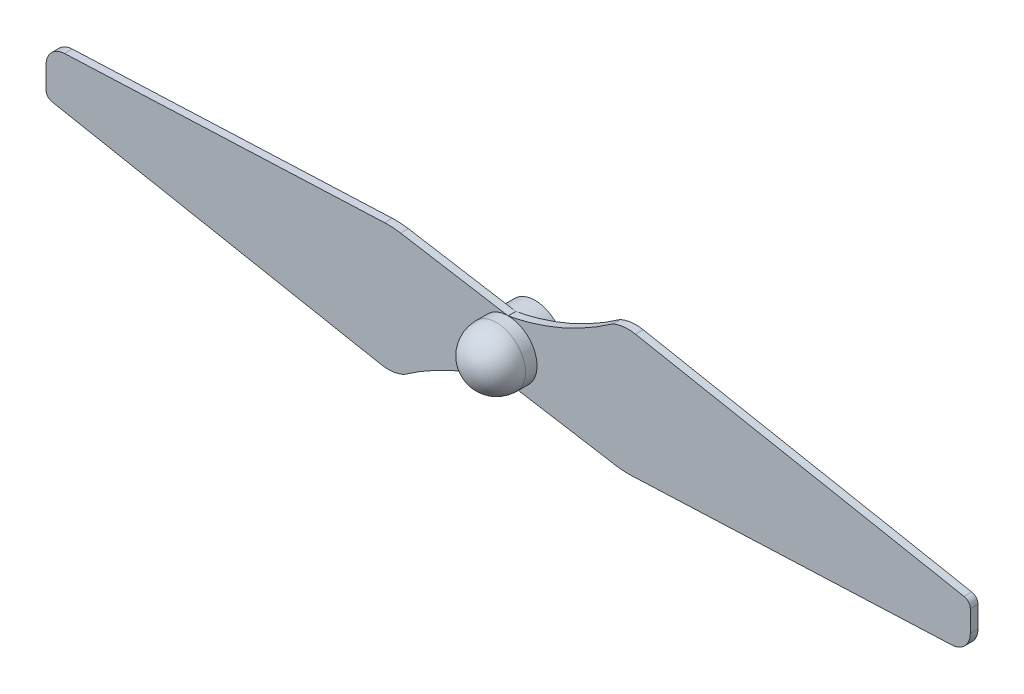
ISO-10303-21;
HEADER;
FILE_DESCRIPTION(('STEP AP214'),'2;1');
FILE_NAME('part.step','',(''),(''),'','','');
FILE_SCHEMA(('AUTOMOTIVE_DESIGN { 1 0 10303 214 1 1 1 1 }'));
ENDSEC;
DATA;
#1=APPLICATION_CONTEXT('core data for automotive mechanical design processes');
#2=APPLICATION_PROTOCOL_DEFINITION('international standard','automotive_design',2000,#1);
#3=PRODUCT_CONTEXT('',#1,'mechanical');
#4=PRODUCT('Part','Part','',(#3));
#5=PRODUCT_RELATED_PRODUCT_CATEGORY('part','',(#4));
#6=PRODUCT_DEFINITION_FORMATION('','',#4);
#7=PRODUCT_DEFINITION_CONTEXT('part definition',#1,'design');
#8=PRODUCT_DEFINITION('design','',#6,#7);
#9=PRODUCT_DEFINITION_SHAPE('','',#8);
#10=(LENGTH_UNIT() NAMED_UNIT(*) SI_UNIT(.MILLI.,.METRE.));
#11=(NAMED_UNIT(*) PLANE_ANGLE_UNIT() SI_UNIT($,.RADIAN.));
#12=(NAMED_UNIT(*) SI_UNIT($,.STERADIAN.) SOLID_ANGLE_UNIT());
#13=UNCERTAINTY_MEASURE_WITH_UNIT(LENGTH_MEASURE(1.E-05),#10,'distance_accuracy_value','');
#14=(GEOMETRIC_REPRESENTATION_CONTEXT(3) GLOBAL_UNCERTAINTY_ASSIGNED_CONTEXT((#13)) GLOBAL_UNIT_ASSIGNED_CONTEXT((#10,
#11,#12)) REPRESENTATION_CONTEXT('',''));
#15=CARTESIAN_POINT('',(0.,0.,0.));
#16=DIRECTION('',(0.,0.,1.));
#17=DIRECTION('',(1.,0.,0.));
#18=AXIS2_PLACEMENT_3D('',#15,#16,#17);
#19=CARTESIAN_POINT('',(0.,0.,10.));
#20=DIRECTION('',(0.,0.,-1.));
#21=DIRECTION('',(-1.,0.,0.));
#22=AXIS2_PLACEMENT_3D('',#19,#20,#21);
#23=CYLINDRICAL_SURFACE('',#22,7.5);
#24=CARTESIAN_POINT('',(0.,0.,10.));
#25=DIRECTION('',(0.,0.,1.));
#26=DIRECTION('',(1.,0.,0.));
#27=AXIS2_PLACEMENT_3D('',#24,#25,#26);
#28=CIRCLE('',#27,7.5);
#29=CARTESIAN_POINT('',(7.5,0.,10.));
#30=VERTEX_POINT('',#29);
#31=EDGE_CURVE('E11',#30,#30,#28,.T.);
#32=ORIENTED_EDGE('',*,*,#31,.F.);
#33=EDGE_LOOP('',(#32));
#34=FACE_BOUND('',#33,.T.);
#35=CARTESIAN_POINT('',(0.,0.,7.));
#36=DIRECTION('',(0.,0.,-1.));
#37=DIRECTION('',(-1.,0.,0.));
#38=AXIS2_PLACEMENT_3D('',#35,#36,#37);
#39=CIRCLE('',#38,7.5);
#40=CARTESIAN_POINT('',(0.,7.5,7.));
#41=VERTEX_POINT('',#40);
#42=CARTESIAN_POINT('',(0.,-7.5,7.));
#43=VERTEX_POINT('',#42);
#44=EDGE_CURVE('E291',#41,#43,#39,.T.);
#45=ORIENTED_EDGE('',*,*,#44,.F.);
#46=EDGE_CURVE('E51',#43,#41,#39,.T.);
#47=ORIENTED_EDGE('',*,*,#46,.F.);
#48=EDGE_LOOP('',(#45,#47));
#49=FACE_BOUND('',#48,.T.);
#50=ADVANCED_FACE('F37',(#34,#49),#23,.T.);
#51=CARTESIAN_POINT('',(0.,0.,10.));
#52=DIRECTION('',(0.,1.,0.));
#53=DIRECTION('',(0.,0.,1.));
#54=AXIS2_PLACEMENT_3D('',#51,#52,#53);
#55=SPHERICAL_SURFACE('',#54,7.5);
#56=CARTESIAN_POINT('',(0.,0.,10.));
#57=DIRECTION('',(0.,0.,1.));
#58=DIRECTION('',(1.,0.,0.));
#59=AXIS2_PLACEMENT_3D('',#56,#57,#58);
#60=SPHERICAL_SURFACE('',#59,7.5);
#61=ORIENTED_EDGE('',*,*,#31,.T.);
#62=EDGE_LOOP('',(#61));
#63=FACE_BOUND('',#62,.T.);
#64=ADVANCED_FACE('F275',(#63),#60,.T.);
#65=CARTESIAN_POINT('',(0.,0.,7.));
#66=DIRECTION('',(0.,0.,-1.));
#67=DIRECTION('',(-1.,0.,0.));
#68=AXIS2_PLACEMENT_3D('',#65,#66,#67);
#69=PLANE('',#68);
#70=CARTESIAN_POINT('',(27.1725837559361,19.2747862942392,7.));
#71=CARTESIAN_POINT('',(14.0344167476328,10.0811053046852,7.));
#72=CARTESIAN_POINT('',(0.,7.5,7.));
#73=B_SPLINE_CURVE_WITH_KNOTS('',2,(#70,#71,#72),.UNSPECIFIED.,.F.,.F.,(3,3),(0.,1.),.UNSPECIFIED.);
#74=CARTESIAN_POINT('',(27.1725837559361,19.2747862942392,7.));
#75=VERTEX_POINT('',#74);
#76=EDGE_CURVE('E177',#75,#41,#73,.T.);
#77=ORIENTED_EDGE('',*,*,#76,.T.);
#78=ORIENTED_EDGE('',*,*,#44,.T.);
#79=DIRECTION('',(-0.986393923832163,0.164398987305245,0.));
#80=VECTOR('',#79,1.);
#81=CARTESIAN_POINT('',(-1.21621621621541,-7.29729729729757,7.));
#82=LINE('',#81,#80);
#83=CARTESIAN_POINT('',(27.9482789369409,-12.1580464894869,7.));
#84=VERTEX_POINT('',#83);
#85=EDGE_CURVE('E210',#84,#43,#82,.T.);
#86=ORIENTED_EDGE('',*,*,#85,.F.);
#87=CARTESIAN_POINT('',(31.2362586830458,7.56983198715637,7.));
#88=DIRECTION('',(0.,0.,-1.));
#89=DIRECTION('',(-1.,0.,0.));
#90=AXIS2_PLACEMENT_3D('',#87,#88,#89);
#91=CIRCLE('',#90,20.);
#92=CARTESIAN_POINT('',(32.0781782100725,-12.4124394430392,7.));
#93=VERTEX_POINT('',#92);
#94=EDGE_CURVE('E207',#93,#84,#91,.T.);
#95=ORIENTED_EDGE('',*,*,#94,.F.);
#96=DIRECTION('',(-0.99911357150978,-0.0420959763513365,0.));
#97=VECTOR('',#96,1.);
#98=CARTESIAN_POINT('',(0.578895402731214,-13.7396089480417,7.));
#99=LINE('',#98,#97);
#100=CARTESIAN_POINT('',(115.210479881756,-8.90979919773144,7.));
#101=VERTEX_POINT('',#100);
#102=EDGE_CURVE('E204',#101,#93,#99,.T.);
#103=ORIENTED_EDGE('',*,*,#102,.F.);
#104=CARTESIAN_POINT('',(115.,-3.91423134018254,7.));
#105=DIRECTION('',(0.,0.,-1.));
#106=DIRECTION('',(-1.,0.,0.));
#107=AXIS2_PLACEMENT_3D('',#104,#105,#106);
#108=CIRCLE('',#107,5.);
#109=CARTESIAN_POINT('',(120.,-3.91423134018197,7.));
#110=VERTEX_POINT('',#109);
#111=EDGE_CURVE('E201',#110,#101,#108,.T.);
#112=ORIENTED_EDGE('',*,*,#111,.F.);
#113=DIRECTION('',(1.12473940876493E-13,-1.,0.));
#114=VECTOR('',#113,1.);
#115=CARTESIAN_POINT('',(119.999999999999,1.34968729051791E-11,7.));
#116=LINE('',#115,#114);
#117=CARTESIAN_POINT('',(119.999999999999,1.6381699225906,7.));
#118=VERTEX_POINT('',#117);
#119=EDGE_CURVE('E198',#118,#110,#116,.T.);
#120=ORIENTED_EDGE('',*,*,#119,.F.);
#121=CARTESIAN_POINT('',(117.999999999999,1.63816992259038,7.));
#122=DIRECTION('',(0.,0.,-1.));
#123=DIRECTION('',(-1.,0.,0.));
#124=AXIS2_PLACEMENT_3D('',#121,#122,#123);
#125=CIRCLE('',#124,2.);
#126=CARTESIAN_POINT('',(118.375596222964,3.6025852242246,7.));
#127=VERTEX_POINT('',#126);
#128=EDGE_CURVE('E190',#127,#118,#125,.T.);
#129=ORIENTED_EDGE('',*,*,#128,.F.);
#130=DIRECTION('',(0.982207650817114,-0.187798111482319,0.));
#131=VECTOR('',#130,1.);
#132=CARTESIAN_POINT('',(4.83940712938196,25.3107055783432,7.));
#133=LINE('',#132,#131);
#134=CARTESIAN_POINT('',(33.0266392471037,19.9213065493109,7.));
#135=VERTEX_POINT('',#134);
#136=EDGE_CURVE('E188',#135,#127,#133,.T.);
#137=ORIENTED_EDGE('',*,*,#136,.F.);
#138=CARTESIAN_POINT('',(31.1486581322792,10.09923004114,7.));
#139=DIRECTION('',(0.,0.,-1.));
#140=DIRECTION('',(-1.,0.,0.));
#141=AXIS2_PLACEMENT_3D('',#138,#139,#140);
#142=CIRCLE('',#141,9.99999999999999);
#143=EDGE_CURVE('E167',#75,#135,#142,.T.);
#144=ORIENTED_EDGE('',*,*,#143,.F.);
#145=EDGE_LOOP('',(#77,#78,#86,#95,#103,#112,#120,#129,#137,#144));
#146=FACE_BOUND('',#145,.T.);
#147=ADVANCED_FACE('F185',(#146),#69,.F.);
#148=CARTESIAN_POINT('',(-27.1725837559391,-19.2747862942361,7.));
#149=CARTESIAN_POINT('',(-14.0344167476329,-10.0811053046851,7.));
#150=CARTESIAN_POINT('',(0.,-7.5,7.));
#151=B_SPLINE_CURVE_WITH_KNOTS('',2,(#148,#149,#150),.UNSPECIFIED.,.F.,.F.,(3,3),(0.,1.),.UNSPECIFIED.);
#152=CARTESIAN_POINT('',(-27.1725837559391,-19.2747862942361,7.));
#153=VERTEX_POINT('',#152);
#154=EDGE_CURVE('E213',#153,#43,#151,.T.);
#155=ORIENTED_EDGE('',*,*,#154,.T.);
#156=ORIENTED_EDGE('',*,*,#46,.T.);
#157=DIRECTION('',(0.986393923832144,-0.164398987305357,0.));
#158=VECTOR('',#157,1.);
#159=CARTESIAN_POINT('',(1.21621621621622,7.2972972972973,7.));
#160=LINE('',#159,#158);
#161=CARTESIAN_POINT('',(-27.9482789369404,12.1580464894901,7.));
#162=VERTEX_POINT('',#161);
#163=EDGE_CURVE('E173',#162,#41,#160,.T.);
#164=ORIENTED_EDGE('',*,*,#163,.F.);
#165=CARTESIAN_POINT('',(-31.2362586830475,-7.56983198715282,7.));
#166=DIRECTION('',(0.,0.,-1.));
#167=DIRECTION('',(-1.,0.,0.));
#168=AXIS2_PLACEMENT_3D('',#165,#166,#167);
#169=CIRCLE('',#168,20.);
#170=CARTESIAN_POINT('',(-32.0781782100719,12.4124394430429,7.));
#171=VERTEX_POINT('',#170);
#172=EDGE_CURVE('E410',#171,#162,#169,.T.);
#173=ORIENTED_EDGE('',*,*,#172,.F.);
#174=DIRECTION('',(0.999113571509785,0.0420959763512226,0.));
#175=VECTOR('',#174,1.);
#176=CARTESIAN_POINT('',(-0.578895402729649,13.7396089480418,7.));
#177=LINE('',#176,#175);
#178=CARTESIAN_POINT('',(-115.210479881756,8.90979919774456,7.));
#179=VERTEX_POINT('',#178);
#180=EDGE_CURVE('E413',#179,#171,#177,.T.);
#181=ORIENTED_EDGE('',*,*,#180,.F.);
#182=CARTESIAN_POINT('',(-115.,3.91423134019502,7.));
#183=DIRECTION('',(0.,0.,-1.));
#184=DIRECTION('',(-1.,0.,0.));
#185=AXIS2_PLACEMENT_3D('',#182,#183,#184);
#186=CIRCLE('',#185,5.00000000000031);
#187=CARTESIAN_POINT('',(-120.,3.91423134019563,7.));
#188=VERTEX_POINT('',#187);
#189=EDGE_CURVE('E416',#188,#179,#186,.T.);
#190=ORIENTED_EDGE('',*,*,#189,.F.);
#191=DIRECTION('',(0.,1.,0.));
#192=VECTOR('',#191,1.);
#193=CARTESIAN_POINT('',(-120.,0.,7.));
#194=LINE('',#193,#192);
#195=CARTESIAN_POINT('',(-120.,-1.63816992257695,7.));
#196=VERTEX_POINT('',#195);
#197=EDGE_CURVE('E419',#196,#188,#194,.T.);
#198=ORIENTED_EDGE('',*,*,#197,.F.);
#199=CARTESIAN_POINT('',(-118.,-1.63816992257761,7.));
#200=DIRECTION('',(0.,0.,-1.));
#201=DIRECTION('',(-1.,0.,0.));
#202=AXIS2_PLACEMENT_3D('',#199,#200,#201);
#203=CIRCLE('',#202,1.99999999999967);
#204=CARTESIAN_POINT('',(-118.375596222965,-3.60258522421113,7.));
#205=VERTEX_POINT('',#204);
#206=EDGE_CURVE('E422',#205,#196,#203,.T.);
#207=ORIENTED_EDGE('',*,*,#206,.F.);
#208=DIRECTION('',(-0.982207650817092,0.187798111482438,0.));
#209=VECTOR('',#208,1.);
#210=CARTESIAN_POINT('',(-4.83940712938521,-25.3107055783436,7.));
#211=LINE('',#210,#209);
#212=CARTESIAN_POINT('',(-33.0266392471066,-19.9213065493078,7.));
#213=VERTEX_POINT('',#212);
#214=EDGE_CURVE('E424',#213,#205,#211,.T.);
#215=ORIENTED_EDGE('',*,*,#214,.F.);
#216=CARTESIAN_POINT('',(-31.1486581322822,-10.0992300411369,7.));
#217=DIRECTION('',(0.,0.,-1.));
#218=DIRECTION('',(-1.,0.,0.));
#219=AXIS2_PLACEMENT_3D('',#216,#217,#218);
#220=CIRCLE('',#219,10.);
#221=EDGE_CURVE('E219',#153,#213,#220,.T.);
#222=ORIENTED_EDGE('',*,*,#221,.F.);
#223=EDGE_LOOP('',(#155,#156,#164,#173,#181,#190,#198,#207,#215,#222));
#224=FACE_BOUND('',#223,.T.);
#225=ADVANCED_FACE('F297',(#224),#69,.F.);
#226=CARTESIAN_POINT('',(0.,0.,5.));
#227=DIRECTION('',(0.,0.,-1.));
#228=DIRECTION('',(-1.,0.,0.));
#229=AXIS2_PLACEMENT_3D('',#226,#227,#228);
#230=PLANE('',#229);
#231=CARTESIAN_POINT('',(0.,0.,5.));
#232=DIRECTION('',(0.,0.,-1.));
#233=DIRECTION('',(-1.,0.,0.));
#234=AXIS2_PLACEMENT_3D('',#231,#232,#233);
#235=CIRCLE('',#234,7.5);
#236=CARTESIAN_POINT('',(0.,7.5,5.));
#237=VERTEX_POINT('',#236);
#238=CARTESIAN_POINT('',(0.,-7.5,5.));
#239=VERTEX_POINT('',#238);
#240=EDGE_CURVE('E302',#237,#239,#235,.T.);
#241=ORIENTED_EDGE('',*,*,#240,.F.);
#242=CARTESIAN_POINT('',(27.1725837559361,19.2747862942392,5.));
#243=CARTESIAN_POINT('',(14.0344167476328,10.0811053046852,5.));
#244=CARTESIAN_POINT('',(0.,7.5,5.));
#245=B_SPLINE_CURVE_WITH_KNOTS('',2,(#242,#243,#244),.UNSPECIFIED.,.F.,.F.,(3,3),(0.,1.),.UNSPECIFIED.);
#246=CARTESIAN_POINT('',(27.1725837559361,19.2747862942392,5.));
#247=VERTEX_POINT('',#246);
#248=EDGE_CURVE('E402',#247,#237,#245,.T.);
#249=ORIENTED_EDGE('',*,*,#248,.F.);
#250=CARTESIAN_POINT('',(31.1486581322792,10.09923004114,5.));
#251=DIRECTION('',(0.,0.,-1.));
#252=DIRECTION('',(-1.,0.,0.));
#253=AXIS2_PLACEMENT_3D('',#250,#251,#252);
#254=CIRCLE('',#253,9.99999999999999);
#255=CARTESIAN_POINT('',(33.0266392471037,19.9213065493109,5.));
#256=VERTEX_POINT('',#255);
#257=EDGE_CURVE('E169',#247,#256,#254,.T.);
#258=ORIENTED_EDGE('',*,*,#257,.T.);
#259=DIRECTION('',(0.982207650817114,-0.187798111482319,0.));
#260=VECTOR('',#259,1.);
#261=CARTESIAN_POINT('',(4.83940712938196,25.3107055783432,5.));
#262=LINE('',#261,#260);
#263=CARTESIAN_POINT('',(118.375596222964,3.6025852242246,5.));
#264=VERTEX_POINT('',#263);
#265=EDGE_CURVE('E398',#256,#264,#262,.T.);
#266=ORIENTED_EDGE('',*,*,#265,.T.);
#267=CARTESIAN_POINT('',(117.999999999999,1.63816992259038,5.));
#268=DIRECTION('',(0.,0.,-1.));
#269=DIRECTION('',(-1.,0.,0.));
#270=AXIS2_PLACEMENT_3D('',#267,#268,#269);
#271=CIRCLE('',#270,2.);
#272=CARTESIAN_POINT('',(119.999999999999,1.6381699225906,5.));
#273=VERTEX_POINT('',#272);
#274=EDGE_CURVE('E395',#264,#273,#271,.T.);
#275=ORIENTED_EDGE('',*,*,#274,.T.);
#276=DIRECTION('',(1.12473940876493E-13,-1.,0.));
#277=VECTOR('',#276,1.);
#278=CARTESIAN_POINT('',(119.999999999999,1.34968729051791E-11,5.));
#279=LINE('',#278,#277);
#280=CARTESIAN_POINT('',(120.,-3.91423134018197,5.));
#281=VERTEX_POINT('',#280);
#282=EDGE_CURVE('E392',#273,#281,#279,.T.);
#283=ORIENTED_EDGE('',*,*,#282,.T.);
#284=CARTESIAN_POINT('',(115.,-3.91423134018254,5.));
#285=DIRECTION('',(0.,0.,-1.));
#286=DIRECTION('',(-1.,0.,0.));
#287=AXIS2_PLACEMENT_3D('',#284,#285,#286);
#288=CIRCLE('',#287,5.);
#289=CARTESIAN_POINT('',(115.210479881756,-8.90979919773144,5.));
#290=VERTEX_POINT('',#289);
#291=EDGE_CURVE('E389',#281,#290,#288,.T.);
#292=ORIENTED_EDGE('',*,*,#291,.T.);
#293=DIRECTION('',(-0.99911357150978,-0.0420959763513365,0.));
#294=VECTOR('',#293,1.);
#295=CARTESIAN_POINT('',(0.578895402731214,-13.7396089480417,5.));
#296=LINE('',#295,#294);
#297=CARTESIAN_POINT('',(32.0781782100725,-12.4124394430392,5.));
#298=VERTEX_POINT('',#297);
#299=EDGE_CURVE('E386',#290,#298,#296,.T.);
#300=ORIENTED_EDGE('',*,*,#299,.T.);
#301=CARTESIAN_POINT('',(31.2362586830458,7.56983198715637,5.));
#302=DIRECTION('',(0.,0.,-1.));
#303=DIRECTION('',(-1.,0.,0.));
#304=AXIS2_PLACEMENT_3D('',#301,#302,#303);
#305=CIRCLE('',#304,20.);
#306=CARTESIAN_POINT('',(27.9482789369409,-12.1580464894869,5.));
#307=VERTEX_POINT('',#306);
#308=EDGE_CURVE('E383',#298,#307,#305,.T.);
#309=ORIENTED_EDGE('',*,*,#308,.T.);
#310=DIRECTION('',(-0.986393923832163,0.164398987305245,0.));
#311=VECTOR('',#310,1.);
#312=CARTESIAN_POINT('',(-1.21621621621541,-7.29729729729757,5.));
#313=LINE('',#312,#311);
#314=EDGE_CURVE('E377',#307,#239,#313,.T.);
#315=ORIENTED_EDGE('',*,*,#314,.T.);
#316=EDGE_LOOP('',(#241,#249,#258,#266,#275,#283,#292,#300,#309,#315));
#317=FACE_BOUND('',#316,.T.);
#318=ADVANCED_FACE('F444',(#317),#230,.T.);
#319=EDGE_CURVE('E304',#239,#237,#235,.T.);
#320=ORIENTED_EDGE('',*,*,#319,.F.);
#321=CARTESIAN_POINT('',(-27.1725837559391,-19.2747862942361,5.));
#322=CARTESIAN_POINT('',(-14.0344167476329,-10.0811053046851,5.));
#323=CARTESIAN_POINT('',(0.,-7.5,5.));
#324=B_SPLINE_CURVE_WITH_KNOTS('',2,(#321,#322,#323),.UNSPECIFIED.,.F.,.F.,(3,3),(0.,1.),.UNSPECIFIED.);
#325=CARTESIAN_POINT('',(-27.1725837559391,-19.2747862942361,5.));
#326=VERTEX_POINT('',#325);
#327=EDGE_CURVE('E372',#326,#239,#324,.T.);
#328=ORIENTED_EDGE('',*,*,#327,.F.);
#329=CARTESIAN_POINT('',(-31.1486581322822,-10.0992300411369,5.));
#330=DIRECTION('',(0.,0.,-1.));
#331=DIRECTION('',(-1.,0.,0.));
#332=AXIS2_PLACEMENT_3D('',#329,#330,#331);
#333=CIRCLE('',#332,10.);
#334=CARTESIAN_POINT('',(-33.0266392471066,-19.9213065493078,5.));
#335=VERTEX_POINT('',#334);
#336=EDGE_CURVE('E369',#326,#335,#333,.T.);
#337=ORIENTED_EDGE('',*,*,#336,.T.);
#338=DIRECTION('',(-0.982207650817092,0.187798111482438,0.));
#339=VECTOR('',#338,1.);
#340=CARTESIAN_POINT('',(-4.83940712938521,-25.3107055783436,5.));
#341=LINE('',#340,#339);
#342=CARTESIAN_POINT('',(-118.375596222965,-3.60258522421113,5.));
#343=VERTEX_POINT('',#342);
#344=EDGE_CURVE('E366',#335,#343,#341,.T.);
#345=ORIENTED_EDGE('',*,*,#344,.T.);
#346=CARTESIAN_POINT('',(-118.,-1.63816992257761,5.));
#347=DIRECTION('',(0.,0.,-1.));
#348=DIRECTION('',(-1.,0.,0.));
#349=AXIS2_PLACEMENT_3D('',#346,#347,#348);
#350=CIRCLE('',#349,1.99999999999967);
#351=CARTESIAN_POINT('',(-120.,-1.63816992257695,5.));
#352=VERTEX_POINT('',#351);
#353=EDGE_CURVE('E363',#343,#352,#350,.T.);
#354=ORIENTED_EDGE('',*,*,#353,.T.);
#355=DIRECTION('',(0.,1.,0.));
#356=VECTOR('',#355,1.);
#357=CARTESIAN_POINT('',(-120.,0.,5.));
#358=LINE('',#357,#356);
#359=CARTESIAN_POINT('',(-120.,3.91423134019563,5.));
#360=VERTEX_POINT('',#359);
#361=EDGE_CURVE('E360',#352,#360,#358,.T.);
#362=ORIENTED_EDGE('',*,*,#361,.T.);
#363=CARTESIAN_POINT('',(-115.,3.91423134019502,5.));
#364=DIRECTION('',(0.,0.,-1.));
#365=DIRECTION('',(-1.,0.,0.));
#366=AXIS2_PLACEMENT_3D('',#363,#364,#365);
#367=CIRCLE('',#366,5.00000000000031);
#368=CARTESIAN_POINT('',(-115.210479881756,8.90979919774456,5.));
#369=VERTEX_POINT('',#368);
#370=EDGE_CURVE('E357',#360,#369,#367,.T.);
#371=ORIENTED_EDGE('',*,*,#370,.T.);
#372=DIRECTION('',(0.999113571509785,0.0420959763512226,0.));
#373=VECTOR('',#372,1.);
#374=CARTESIAN_POINT('',(-0.578895402729649,13.7396089480418,5.));
#375=LINE('',#374,#373);
#376=CARTESIAN_POINT('',(-32.0781782100719,12.4124394430429,5.));
#377=VERTEX_POINT('',#376);
#378=EDGE_CURVE('E354',#369,#377,#375,.T.);
#379=ORIENTED_EDGE('',*,*,#378,.T.);
#380=CARTESIAN_POINT('',(-31.2362586830475,-7.56983198715282,5.));
#381=DIRECTION('',(0.,0.,-1.));
#382=DIRECTION('',(-1.,0.,0.));
#383=AXIS2_PLACEMENT_3D('',#380,#381,#382);
#384=CIRCLE('',#383,20.);
#385=CARTESIAN_POINT('',(-27.9482789369404,12.1580464894901,5.));
#386=VERTEX_POINT('',#385);
#387=EDGE_CURVE('E352',#377,#386,#384,.T.);
#388=ORIENTED_EDGE('',*,*,#387,.T.);
#389=DIRECTION('',(0.986393923832144,-0.164398987305357,0.));
#390=VECTOR('',#389,1.);
#391=CARTESIAN_POINT('',(1.21621621621622,7.2972972972973,5.));
#392=LINE('',#391,#390);
#393=EDGE_CURVE('E59',#386,#237,#392,.T.);
#394=ORIENTED_EDGE('',*,*,#393,.T.);
#395=EDGE_LOOP('',(#320,#328,#337,#345,#354,#362,#371,#379,#388,#394));
#396=FACE_BOUND('',#395,.T.);
#397=ADVANCED_FACE('F265',(#396),#230,.T.);
#398=DIRECTION('',(0.,0.,-1.));
#399=VECTOR('',#398,1.);
#400=SURFACE_OF_LINEAR_EXTRUSION('',#73,#399);
#401=ORIENTED_EDGE('',*,*,#248,.T.);
#402=DIRECTION('',(0.,0.,-1.));
#403=VECTOR('',#402,1.);
#404=CARTESIAN_POINT('',(0.,7.5,7.));
#405=LINE('',#404,#403);
#406=EDGE_CURVE('E180',#41,#237,#405,.T.);
#407=ORIENTED_EDGE('',*,*,#406,.F.);
#408=ORIENTED_EDGE('',*,*,#76,.F.);
#409=DIRECTION('',(0.,0.,-1.));
#410=VECTOR('',#409,1.);
#411=CARTESIAN_POINT('',(27.1725837559361,19.2747862942392,7.));
#412=LINE('',#411,#410);
#413=EDGE_CURVE('E163',#75,#247,#412,.T.);
#414=ORIENTED_EDGE('',*,*,#413,.T.);
#415=EDGE_LOOP('',(#401,#407,#408,#414));
#416=FACE_BOUND('',#415,.T.);
#417=ADVANCED_FACE('F178',(#416),#400,.F.);
#418=CARTESIAN_POINT('',(1.21621621621622,7.2972972972973,7.));
#419=DIRECTION('',(0.164398987305357,0.986393923832144,0.));
#420=DIRECTION('',(-0.986393923832144,0.164398987305357,0.));
#421=AXIS2_PLACEMENT_3D('',#418,#419,#420);
#422=PLANE('',#421);
#423=ORIENTED_EDGE('',*,*,#393,.F.);
#424=DIRECTION('',(0.,0.,-1.));
#425=VECTOR('',#424,1.);
#426=CARTESIAN_POINT('',(-27.9482789369404,12.1580464894901,7.));
#427=LINE('',#426,#425);
#428=EDGE_CURVE('E348',#162,#386,#427,.T.);
#429=ORIENTED_EDGE('',*,*,#428,.F.);
#430=ORIENTED_EDGE('',*,*,#163,.T.);
#431=ORIENTED_EDGE('',*,*,#406,.T.);
#432=EDGE_LOOP('',(#423,#429,#430,#431));
#433=FACE_BOUND('',#432,.T.);
#434=ADVANCED_FACE('F264',(#433),#422,.T.);
#435=CARTESIAN_POINT('',(-31.2362586830475,-7.56983198715282,7.));
#436=DIRECTION('',(0.,0.,-1.));
#437=DIRECTION('',(-1.,0.,0.));
#438=AXIS2_PLACEMENT_3D('',#435,#436,#437);
#439=CYLINDRICAL_SURFACE('',#438,20.);
#440=ORIENTED_EDGE('',*,*,#387,.F.);
#441=DIRECTION('',(0.,0.,-1.));
#442=VECTOR('',#441,1.);
#443=CARTESIAN_POINT('',(-32.0781782100719,12.4124394430429,7.));
#444=LINE('',#443,#442);
#445=EDGE_CURVE('E346',#171,#377,#444,.T.);
#446=ORIENTED_EDGE('',*,*,#445,.F.);
#447=ORIENTED_EDGE('',*,*,#172,.T.);
#448=ORIENTED_EDGE('',*,*,#428,.T.);
#449=EDGE_LOOP('',(#440,#446,#447,#448));
#450=FACE_BOUND('',#449,.T.);
#451=ADVANCED_FACE('F458',(#450),#439,.T.);
#452=CARTESIAN_POINT('',(-0.578895402729649,13.7396089480418,7.));
#453=DIRECTION('',(-0.0420959763512226,0.999113571509785,0.));
#454=DIRECTION('',(-0.999113571509785,-0.0420959763512226,0.));
#455=AXIS2_PLACEMENT_3D('',#452,#453,#454);
#456=PLANE('',#455);
#457=ORIENTED_EDGE('',*,*,#378,.F.);
#458=DIRECTION('',(0.,0.,-1.));
#459=VECTOR('',#458,1.);
#460=CARTESIAN_POINT('',(-115.210479881756,8.90979919774456,7.));
#461=LINE('',#460,#459);
#462=EDGE_CURVE('E344',#179,#369,#461,.T.);
#463=ORIENTED_EDGE('',*,*,#462,.F.);
#464=ORIENTED_EDGE('',*,*,#180,.T.);
#465=ORIENTED_EDGE('',*,*,#445,.T.);
#466=EDGE_LOOP('',(#457,#463,#464,#465));
#467=FACE_BOUND('',#466,.T.);
#468=ADVANCED_FACE('F462',(#467),#456,.T.);
#469=CARTESIAN_POINT('',(-115.,3.91423134019502,7.));
#470=DIRECTION('',(0.,0.,-1.));
#471=DIRECTION('',(-1.,0.,0.));
#472=AXIS2_PLACEMENT_3D('',#469,#470,#471);
#473=CYLINDRICAL_SURFACE('',#472,5.00000000000031);
#474=ORIENTED_EDGE('',*,*,#370,.F.);
#475=DIRECTION('',(0.,0.,-1.));
#476=VECTOR('',#475,1.);
#477=CARTESIAN_POINT('',(-120.,3.91423134019563,7.));
#478=LINE('',#477,#476);
#479=EDGE_CURVE('E342',#188,#360,#478,.T.);
#480=ORIENTED_EDGE('',*,*,#479,.F.);
#481=ORIENTED_EDGE('',*,*,#189,.T.);
#482=ORIENTED_EDGE('',*,*,#462,.T.);
#483=EDGE_LOOP('',(#474,#480,#481,#482));
#484=FACE_BOUND('',#483,.T.);
#485=ADVANCED_FACE('F465',(#484),#473,.T.);
#486=CARTESIAN_POINT('',(-120.,0.,7.));
#487=DIRECTION('',(-1.,0.,0.));
#488=DIRECTION('',(0.,0.,1.));
#489=AXIS2_PLACEMENT_3D('',#486,#487,#488);
#490=PLANE('',#489);
#491=ORIENTED_EDGE('',*,*,#361,.F.);
#492=DIRECTION('',(0.,0.,-1.));
#493=VECTOR('',#492,1.);
#494=CARTESIAN_POINT('',(-120.,-1.63816992257695,7.));
#495=LINE('',#494,#493);
#496=EDGE_CURVE('E340',#196,#352,#495,.T.);
#497=ORIENTED_EDGE('',*,*,#496,.F.);
#498=ORIENTED_EDGE('',*,*,#197,.T.);
#499=ORIENTED_EDGE('',*,*,#479,.T.);
#500=EDGE_LOOP('',(#491,#497,#498,#499));
#501=FACE_BOUND('',#500,.T.);
#502=ADVANCED_FACE('F467',(#501),#490,.T.);
#503=CARTESIAN_POINT('',(-118.,-1.63816992257761,7.));
#504=DIRECTION('',(0.,0.,-1.));
#505=DIRECTION('',(-1.,0.,0.));
#506=AXIS2_PLACEMENT_3D('',#503,#504,#505);
#507=CYLINDRICAL_SURFACE('',#506,1.99999999999967);
#508=ORIENTED_EDGE('',*,*,#353,.F.);
#509=DIRECTION('',(0.,0.,-1.));
#510=VECTOR('',#509,1.);
#511=CARTESIAN_POINT('',(-118.375596222965,-3.60258522421113,7.));
#512=LINE('',#511,#510);
#513=EDGE_CURVE('E338',#205,#343,#512,.T.);
#514=ORIENTED_EDGE('',*,*,#513,.F.);
#515=ORIENTED_EDGE('',*,*,#206,.T.);
#516=ORIENTED_EDGE('',*,*,#496,.T.);
#517=EDGE_LOOP('',(#508,#514,#515,#516));
#518=FACE_BOUND('',#517,.T.);
#519=ADVANCED_FACE('F437',(#518),#507,.T.);
#520=CARTESIAN_POINT('',(-4.83940712938521,-25.3107055783436,7.));
#521=DIRECTION('',(-0.187798111482438,-0.982207650817092,0.));
#522=DIRECTION('',(0.982207650817092,-0.187798111482438,0.));
#523=AXIS2_PLACEMENT_3D('',#520,#521,#522);
#524=PLANE('',#523);
#525=ORIENTED_EDGE('',*,*,#344,.F.);
#526=DIRECTION('',(0.,0.,-1.));
#527=VECTOR('',#526,1.);
#528=CARTESIAN_POINT('',(-33.0266392471066,-19.9213065493078,7.));
#529=LINE('',#528,#527);
#530=EDGE_CURVE('E336',#213,#335,#529,.T.);
#531=ORIENTED_EDGE('',*,*,#530,.F.);
#532=ORIENTED_EDGE('',*,*,#214,.T.);
#533=ORIENTED_EDGE('',*,*,#513,.T.);
#534=EDGE_LOOP('',(#525,#531,#532,#533));
#535=FACE_BOUND('',#534,.T.);
#536=ADVANCED_FACE('F439',(#535),#524,.T.);
#537=CARTESIAN_POINT('',(-31.1486581322822,-10.0992300411369,7.));
#538=DIRECTION('',(0.,0.,-1.));
#539=DIRECTION('',(-1.,0.,0.));
#540=AXIS2_PLACEMENT_3D('',#537,#538,#539);
#541=CYLINDRICAL_SURFACE('',#540,10.);
#542=ORIENTED_EDGE('',*,*,#336,.F.);
#543=DIRECTION('',(0.,0.,-1.));
#544=VECTOR('',#543,1.);
#545=CARTESIAN_POINT('',(-27.1725837559391,-19.2747862942361,7.));
#546=LINE('',#545,#544);
#547=EDGE_CURVE('E334',#153,#326,#546,.T.);
#548=ORIENTED_EDGE('',*,*,#547,.F.);
#549=ORIENTED_EDGE('',*,*,#221,.T.);
#550=ORIENTED_EDGE('',*,*,#530,.T.);
#551=EDGE_LOOP('',(#542,#548,#549,#550));
#552=FACE_BOUND('',#551,.T.);
#553=ADVANCED_FACE('F230',(#552),#541,.T.);
#554=DIRECTION('',(0.,0.,-1.));
#555=VECTOR('',#554,1.);
#556=SURFACE_OF_LINEAR_EXTRUSION('',#151,#555);
#557=ORIENTED_EDGE('',*,*,#327,.T.);
#558=DIRECTION('',(0.,0.,-1.));
#559=VECTOR('',#558,1.);
#560=CARTESIAN_POINT('',(0.,-7.5,7.));
#561=LINE('',#560,#559);
#562=EDGE_CURVE('E331',#43,#239,#561,.T.);
#563=ORIENTED_EDGE('',*,*,#562,.F.);
#564=ORIENTED_EDGE('',*,*,#154,.F.);
#565=ORIENTED_EDGE('',*,*,#547,.T.);
#566=EDGE_LOOP('',(#557,#563,#564,#565));
#567=FACE_BOUND('',#566,.T.);
#568=ADVANCED_FACE('F225',(#567),#556,.F.);
#569=CARTESIAN_POINT('',(-1.21621621621541,-7.29729729729757,7.));
#570=DIRECTION('',(-0.164398987305245,-0.986393923832163,0.));
#571=DIRECTION('',(0.986393923832163,-0.164398987305245,0.));
#572=AXIS2_PLACEMENT_3D('',#569,#570,#571);
#573=PLANE('',#572);
#574=ORIENTED_EDGE('',*,*,#314,.F.);
#575=DIRECTION('',(0.,0.,-1.));
#576=VECTOR('',#575,1.);
#577=CARTESIAN_POINT('',(27.9482789369409,-12.1580464894869,7.));
#578=LINE('',#577,#576);
#579=EDGE_CURVE('E329',#84,#307,#578,.T.);
#580=ORIENTED_EDGE('',*,*,#579,.F.);
#581=ORIENTED_EDGE('',*,*,#85,.T.);
#582=ORIENTED_EDGE('',*,*,#562,.T.);
#583=EDGE_LOOP('',(#574,#580,#581,#582));
#584=FACE_BOUND('',#583,.T.);
#585=ADVANCED_FACE('F229',(#584),#573,.T.);
#586=CARTESIAN_POINT('',(31.2362586830458,7.56983198715637,7.));
#587=DIRECTION('',(0.,0.,-1.));
#588=DIRECTION('',(-1.,0.,0.));
#589=AXIS2_PLACEMENT_3D('',#586,#587,#588);
#590=CYLINDRICAL_SURFACE('',#589,20.);
#591=ORIENTED_EDGE('',*,*,#308,.F.);
#592=DIRECTION('',(0.,0.,-1.));
#593=VECTOR('',#592,1.);
#594=CARTESIAN_POINT('',(32.0781782100725,-12.4124394430392,7.));
#595=LINE('',#594,#593);
#596=EDGE_CURVE('E327',#93,#298,#595,.T.);
#597=ORIENTED_EDGE('',*,*,#596,.F.);
#598=ORIENTED_EDGE('',*,*,#94,.T.);
#599=ORIENTED_EDGE('',*,*,#579,.T.);
#600=EDGE_LOOP('',(#591,#597,#598,#599));
#601=FACE_BOUND('',#600,.T.);
#602=ADVANCED_FACE('F235',(#601),#590,.T.);
#603=CARTESIAN_POINT('',(0.578895402731214,-13.7396089480417,7.));
#604=DIRECTION('',(0.0420959763513365,-0.99911357150978,0.));
#605=DIRECTION('',(0.99911357150978,0.0420959763513365,0.));
#606=AXIS2_PLACEMENT_3D('',#603,#604,#605);
#607=PLANE('',#606);
#608=ORIENTED_EDGE('',*,*,#299,.F.);
#609=DIRECTION('',(0.,0.,-1.));
#610=VECTOR('',#609,1.);
#611=CARTESIAN_POINT('',(115.210479881756,-8.90979919773144,7.));
#612=LINE('',#611,#610);
#613=EDGE_CURVE('E325',#101,#290,#612,.T.);
#614=ORIENTED_EDGE('',*,*,#613,.F.);
#615=ORIENTED_EDGE('',*,*,#102,.T.);
#616=ORIENTED_EDGE('',*,*,#596,.T.);
#617=EDGE_LOOP('',(#608,#614,#615,#616));
#618=FACE_BOUND('',#617,.T.);
#619=ADVANCED_FACE('F239',(#618),#607,.T.);
#620=CARTESIAN_POINT('',(115.,-3.91423134018254,7.));
#621=DIRECTION('',(0.,0.,-1.));
#622=DIRECTION('',(-1.,0.,0.));
#623=AXIS2_PLACEMENT_3D('',#620,#621,#622);
#624=CYLINDRICAL_SURFACE('',#623,5.);
#625=ORIENTED_EDGE('',*,*,#291,.F.);
#626=DIRECTION('',(0.,0.,-1.));
#627=VECTOR('',#626,1.);
#628=CARTESIAN_POINT('',(120.,-3.91423134018197,7.));
#629=LINE('',#628,#627);
#630=EDGE_CURVE('E323',#110,#281,#629,.T.);
#631=ORIENTED_EDGE('',*,*,#630,.F.);
#632=ORIENTED_EDGE('',*,*,#111,.T.);
#633=ORIENTED_EDGE('',*,*,#613,.T.);
#634=EDGE_LOOP('',(#625,#631,#632,#633));
#635=FACE_BOUND('',#634,.T.);
#636=ADVANCED_FACE('F243',(#635),#624,.T.);
#637=CARTESIAN_POINT('',(119.999999999999,1.34968729051791E-11,7.));
#638=DIRECTION('',(1.,1.12473940876493E-13,0.));
#639=DIRECTION('',(-1.12473940876493E-13,1.,0.));
#640=AXIS2_PLACEMENT_3D('',#637,#638,#639);
#641=PLANE('',#640);
#642=ORIENTED_EDGE('',*,*,#282,.F.);
#643=DIRECTION('',(0.,0.,-1.));
#644=VECTOR('',#643,1.);
#645=CARTESIAN_POINT('',(119.999999999999,1.6381699225906,7.));
#646=LINE('',#645,#644);
#647=EDGE_CURVE('E321',#118,#273,#646,.T.);
#648=ORIENTED_EDGE('',*,*,#647,.F.);
#649=ORIENTED_EDGE('',*,*,#119,.T.);
#650=ORIENTED_EDGE('',*,*,#630,.T.);
#651=EDGE_LOOP('',(#642,#648,#649,#650));
#652=FACE_BOUND('',#651,.T.);
#653=ADVANCED_FACE('F247',(#652),#641,.T.);
#654=CARTESIAN_POINT('',(117.999999999999,1.63816992259038,7.));
#655=DIRECTION('',(0.,0.,-1.));
#656=DIRECTION('',(-1.,0.,0.));
#657=AXIS2_PLACEMENT_3D('',#654,#655,#656);
#658=CYLINDRICAL_SURFACE('',#657,2.);
#659=ORIENTED_EDGE('',*,*,#274,.F.);
#660=DIRECTION('',(0.,0.,-1.));
#661=VECTOR('',#660,1.);
#662=CARTESIAN_POINT('',(118.375596222964,3.6025852242246,7.));
#663=LINE('',#662,#661);
#664=EDGE_CURVE('E319',#127,#264,#663,.T.);
#665=ORIENTED_EDGE('',*,*,#664,.F.);
#666=ORIENTED_EDGE('',*,*,#128,.T.);
#667=ORIENTED_EDGE('',*,*,#647,.T.);
#668=EDGE_LOOP('',(#659,#665,#666,#667));
#669=FACE_BOUND('',#668,.T.);
#670=ADVANCED_FACE('F251',(#669),#658,.T.);
#671=CARTESIAN_POINT('',(4.83940712938196,25.3107055783432,7.));
#672=DIRECTION('',(0.187798111482319,0.982207650817114,0.));
#673=DIRECTION('',(-0.982207650817114,0.187798111482319,0.));
#674=AXIS2_PLACEMENT_3D('',#671,#672,#673);
#675=PLANE('',#674);
#676=ORIENTED_EDGE('',*,*,#265,.F.);
#677=DIRECTION('',(0.,0.,-1.));
#678=VECTOR('',#677,1.);
#679=CARTESIAN_POINT('',(33.0266392471037,19.9213065493109,7.));
#680=LINE('',#679,#678);
#681=EDGE_CURVE('E172',#135,#256,#680,.T.);
#682=ORIENTED_EDGE('',*,*,#681,.F.);
#683=ORIENTED_EDGE('',*,*,#136,.T.);
#684=ORIENTED_EDGE('',*,*,#664,.T.);
#685=EDGE_LOOP('',(#676,#682,#683,#684));
#686=FACE_BOUND('',#685,.T.);
#687=ADVANCED_FACE('F255',(#686),#675,.T.);
#688=CARTESIAN_POINT('',(31.1486581322792,10.09923004114,7.));
#689=DIRECTION('',(0.,0.,-1.));
#690=DIRECTION('',(-1.,0.,0.));
#691=AXIS2_PLACEMENT_3D('',#688,#689,#690);
#692=CYLINDRICAL_SURFACE('',#691,9.99999999999999);
#693=ORIENTED_EDGE('',*,*,#257,.F.);
#694=ORIENTED_EDGE('',*,*,#413,.F.);
#695=ORIENTED_EDGE('',*,*,#143,.T.);
#696=ORIENTED_EDGE('',*,*,#681,.T.);
#697=EDGE_LOOP('',(#693,#694,#695,#696));
#698=FACE_BOUND('',#697,.T.);
#699=ADVANCED_FACE('F165',(#698),#692,.T.);
#700=ORIENTED_EDGE('',*,*,#319,.T.);
#701=ORIENTED_EDGE('',*,*,#240,.T.);
#702=EDGE_LOOP('',(#700,#701));
#703=FACE_BOUND('',#702,.T.);
#704=CARTESIAN_POINT('',(0.,0.,0.));
#705=DIRECTION('',(0.,0.,1.));
#706=DIRECTION('',(1.,0.,0.));
#707=AXIS2_PLACEMENT_3D('',#704,#705,#706);
#708=CIRCLE('',#707,7.5);
#709=CARTESIAN_POINT('',(7.5,0.,0.));
#710=VERTEX_POINT('',#709);
#711=EDGE_CURVE('E41',#710,#710,#708,.T.);
#712=ORIENTED_EDGE('',*,*,#711,.T.);
#713=EDGE_LOOP('',(#712));
#714=FACE_BOUND('',#713,.T.);
#715=ADVANCED_FACE('F39',(#703,#714),#23,.T.);
#716=CARTESIAN_POINT('',(0.,0.,0.));
#717=DIRECTION('',(0.,0.,1.));
#718=DIRECTION('',(1.,0.,0.));
#719=AXIS2_PLACEMENT_3D('',#716,#717,#718);
#720=PLANE('',#719);
#721=CARTESIAN_POINT('',(0.,0.,0.));
#722=DIRECTION('',(0.,0.,-1.));
#723=DIRECTION('',(-1.,0.,0.));
#724=AXIS2_PLACEMENT_3D('',#721,#722,#723);
#725=CIRCLE('',#724,2.5);
#726=CARTESIAN_POINT('',(-2.5,0.,0.));
#727=VERTEX_POINT('',#726);
#728=EDGE_CURVE('E293',#727,#727,#725,.T.);
#729=ORIENTED_EDGE('',*,*,#728,.F.);
#730=EDGE_LOOP('',(#729));
#731=FACE_BOUND('',#730,.T.);
#732=ORIENTED_EDGE('',*,*,#711,.F.);
#733=EDGE_LOOP('',(#732));
#734=FACE_BOUND('',#733,.T.);
#735=ADVANCED_FACE('F273',(#731,#734),#720,.F.);
#736=CARTESIAN_POINT('',(0.,0.,14.));
#737=DIRECTION('',(0.,0.,-1.));
#738=DIRECTION('',(-1.,0.,0.));
#739=AXIS2_PLACEMENT_3D('',#736,#737,#738);
#740=CYLINDRICAL_SURFACE('',#739,2.5);
#741=ORIENTED_EDGE('',*,*,#728,.T.);
#742=EDGE_LOOP('',(#741));
#743=FACE_BOUND('',#742,.T.);
#744=CARTESIAN_POINT('',(0.,0.,14.));
#745=DIRECTION('',(0.,0.,-1.));
#746=DIRECTION('',(-1.,0.,0.));
#747=AXIS2_PLACEMENT_3D('',#744,#745,#746);
#748=CIRCLE('',#747,2.5);
#749=CARTESIAN_POINT('',(-2.5,0.,14.));
#750=VERTEX_POINT('',#749);
#751=EDGE_CURVE('E307',#750,#750,#748,.T.);
#752=ORIENTED_EDGE('',*,*,#751,.F.);
#753=EDGE_LOOP('',(#752));
#754=FACE_BOUND('',#753,.T.);
#755=ADVANCED_FACE('F269',(#743,#754),#740,.F.);
#756=CARTESIAN_POINT('',(0.,0.,14.));
#757=DIRECTION('',(0.,0.,-1.));
#758=DIRECTION('',(-1.,0.,0.));
#759=AXIS2_PLACEMENT_3D('',#756,#757,#758);
#760=PLANE('',#759);
#761=ORIENTED_EDGE('',*,*,#751,.T.);
#762=EDGE_LOOP('',(#761));
#763=FACE_BOUND('',#762,.T.);
#764=ADVANCED_FACE('F266',(#763),#760,.T.);
#765=CLOSED_SHELL('',(#50,#64,#147,#225,#318,#397,#417,#434,#451,#468,#485,#502,#519,#536,#553,
#568,#585,#602,#619,#636,#653,#670,#687,#699,#715,#735,#755,#764));
#766=MANIFOLD_SOLID_BREP('B2',#765);
#767=ADVANCED_BREP_SHAPE_REPRESENTATION('',(#18,#766),#14);
#768=SHAPE_DEFINITION_REPRESENTATION(#9,#767);
ENDSEC;
END-ISO-10303-21;
